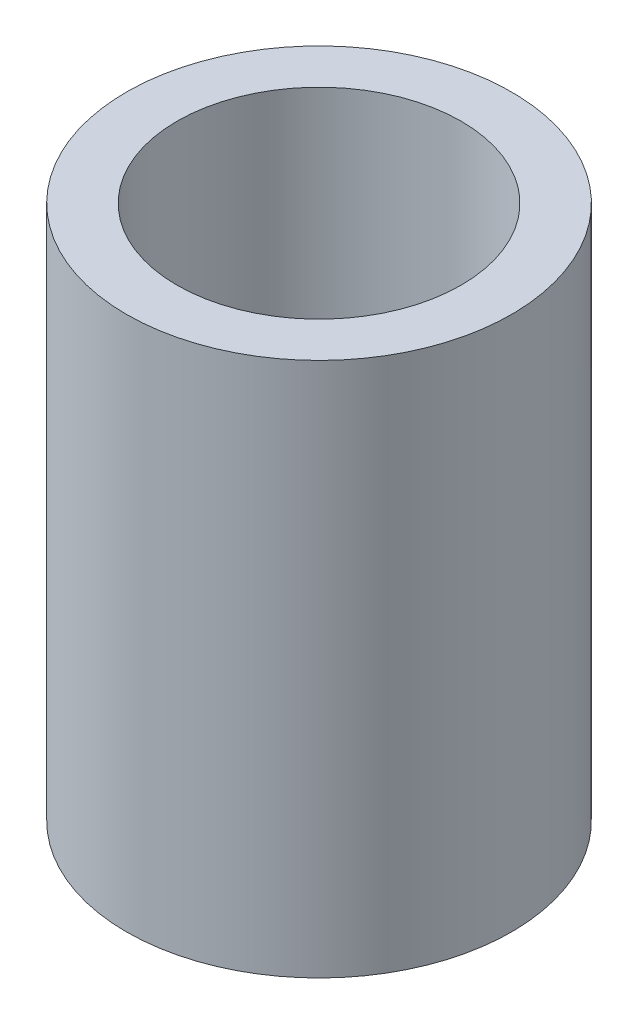
ISO-10303-21;
HEADER;
FILE_DESCRIPTION(('STEP AP214'),'2;1');
FILE_NAME('part.step','',(''),(''),'','','');
FILE_SCHEMA(('AUTOMOTIVE_DESIGN { 1 0 10303 214 1 1 1 1 }'));
ENDSEC;
DATA;
#1=APPLICATION_CONTEXT('core data for automotive mechanical design processes');
#2=APPLICATION_PROTOCOL_DEFINITION('international standard','automotive_design',2000,#1);
#3=PRODUCT_CONTEXT('',#1,'mechanical');
#4=PRODUCT('Part','Part','',(#3));
#5=PRODUCT_RELATED_PRODUCT_CATEGORY('part','',(#4));
#6=PRODUCT_DEFINITION_FORMATION('','',#4);
#7=PRODUCT_DEFINITION_CONTEXT('part definition',#1,'design');
#8=PRODUCT_DEFINITION('design','',#6,#7);
#9=PRODUCT_DEFINITION_SHAPE('','',#8);
#10=(LENGTH_UNIT() NAMED_UNIT(*) SI_UNIT(.MILLI.,.METRE.));
#11=(NAMED_UNIT(*) PLANE_ANGLE_UNIT() SI_UNIT($,.RADIAN.));
#12=(NAMED_UNIT(*) SI_UNIT($,.STERADIAN.) SOLID_ANGLE_UNIT());
#13=UNCERTAINTY_MEASURE_WITH_UNIT(LENGTH_MEASURE(1.E-05),#10,'distance_accuracy_value','');
#14=(GEOMETRIC_REPRESENTATION_CONTEXT(3) GLOBAL_UNCERTAINTY_ASSIGNED_CONTEXT((#13)) GLOBAL_UNIT_ASSIGNED_CONTEXT((#10,
#11,#12)) REPRESENTATION_CONTEXT('',''));
#15=CARTESIAN_POINT('',(0.,0.,0.));
#16=DIRECTION('',(0.,0.,1.));
#17=DIRECTION('',(1.,0.,0.));
#18=AXIS2_PLACEMENT_3D('',#15,#16,#17);
#19=CARTESIAN_POINT('',(0.,0.,0.));
#20=DIRECTION('',(0.,1.,0.));
#21=DIRECTION('',(0.,0.,1.));
#22=AXIS2_PLACEMENT_3D('',#19,#20,#21);
#23=PLANE('',#22);
#24=CARTESIAN_POINT('',(0.,0.,0.));
#25=DIRECTION('',(0.,1.,0.));
#26=DIRECTION('',(0.,0.,1.));
#27=AXIS2_PLACEMENT_3D('',#24,#25,#26);
#28=CIRCLE('',#27,4.5734375);
#29=CARTESIAN_POINT('',(0.,0.,4.5734375));
#30=VERTEX_POINT('',#29);
#31=EDGE_CURVE('E10',#30,#30,#28,.T.);
#32=ORIENTED_EDGE('',*,*,#31,.F.);
#33=EDGE_LOOP('',(#32));
#34=FACE_BOUND('',#33,.T.);
#35=CARTESIAN_POINT('',(0.,0.,0.));
#36=DIRECTION('',(0.,1.,0.));
#37=DIRECTION('',(0.,0.,1.));
#38=AXIS2_PLACEMENT_3D('',#35,#36,#37);
#39=CIRCLE('',#38,3.3734375);
#40=CARTESIAN_POINT('',(0.,0.,3.3734375));
#41=VERTEX_POINT('',#40);
#42=EDGE_CURVE('E40',#41,#41,#39,.T.);
#43=ORIENTED_EDGE('',*,*,#42,.T.);
#44=EDGE_LOOP('',(#43));
#45=FACE_BOUND('',#44,.T.);
#46=ADVANCED_FACE('F33',(#34,#45),#23,.F.);
#47=CARTESIAN_POINT('',(0.,3.175,0.));
#48=DIRECTION('',(0.,-1.,0.));
#49=DIRECTION('',(0.,0.,-1.));
#50=AXIS2_PLACEMENT_3D('',#47,#48,#49);
#51=CYLINDRICAL_SURFACE('',#50,4.5734375);
#52=ORIENTED_EDGE('',*,*,#31,.T.);
#53=EDGE_LOOP('',(#52));
#54=FACE_BOUND('',#53,.T.);
#55=CARTESIAN_POINT('',(0.,12.7,0.));
#56=DIRECTION('',(0.,1.,0.));
#57=DIRECTION('',(0.,0.,1.));
#58=AXIS2_PLACEMENT_3D('',#55,#56,#57);
#59=CIRCLE('',#58,4.5734375);
#60=CARTESIAN_POINT('',(0.,12.7,4.5734375));
#61=VERTEX_POINT('',#60);
#62=EDGE_CURVE('E44',#61,#61,#59,.T.);
#63=ORIENTED_EDGE('',*,*,#62,.F.);
#64=EDGE_LOOP('',(#63));
#65=FACE_BOUND('',#64,.T.);
#66=ADVANCED_FACE('F35',(#54,#65),#51,.T.);
#67=CARTESIAN_POINT('',(0.,3.175,0.));
#68=DIRECTION('',(0.,-1.,0.));
#69=DIRECTION('',(0.,0.,-1.));
#70=AXIS2_PLACEMENT_3D('',#67,#68,#69);
#71=CYLINDRICAL_SURFACE('',#70,3.3734375);
#72=ORIENTED_EDGE('',*,*,#42,.F.);
#73=EDGE_LOOP('',(#72));
#74=FACE_BOUND('',#73,.T.);
#75=CARTESIAN_POINT('',(0.,12.7,0.));
#76=DIRECTION('',(0.,1.,0.));
#77=DIRECTION('',(0.,0.,1.));
#78=AXIS2_PLACEMENT_3D('',#75,#76,#77);
#79=CIRCLE('',#78,3.3734375);
#80=CARTESIAN_POINT('',(0.,12.7,3.3734375));
#81=VERTEX_POINT('',#80);
#82=EDGE_CURVE('E48',#81,#81,#79,.T.);
#83=ORIENTED_EDGE('',*,*,#82,.T.);
#84=EDGE_LOOP('',(#83));
#85=FACE_BOUND('',#84,.T.);
#86=ADVANCED_FACE('F54',(#74,#85),#71,.F.);
#87=CARTESIAN_POINT('',(0.,12.7,0.));
#88=DIRECTION('',(0.,1.,0.));
#89=DIRECTION('',(0.,0.,1.));
#90=AXIS2_PLACEMENT_3D('',#87,#88,#89);
#91=PLANE('',#90);
#92=ORIENTED_EDGE('',*,*,#62,.T.);
#93=EDGE_LOOP('',(#92));
#94=FACE_BOUND('',#93,.T.);
#95=ORIENTED_EDGE('',*,*,#82,.F.);
#96=EDGE_LOOP('',(#95));
#97=FACE_BOUND('',#96,.T.);
#98=ADVANCED_FACE('F56',(#94,#97),#91,.T.);
#99=CLOSED_SHELL('',(#46,#66,#86,#98));
#100=MANIFOLD_SOLID_BREP('B2',#99);
#101=ADVANCED_BREP_SHAPE_REPRESENTATION('',(#18,#100),#14);
#102=SHAPE_DEFINITION_REPRESENTATION(#9,#101);
ENDSEC;
END-ISO-10303-21;
